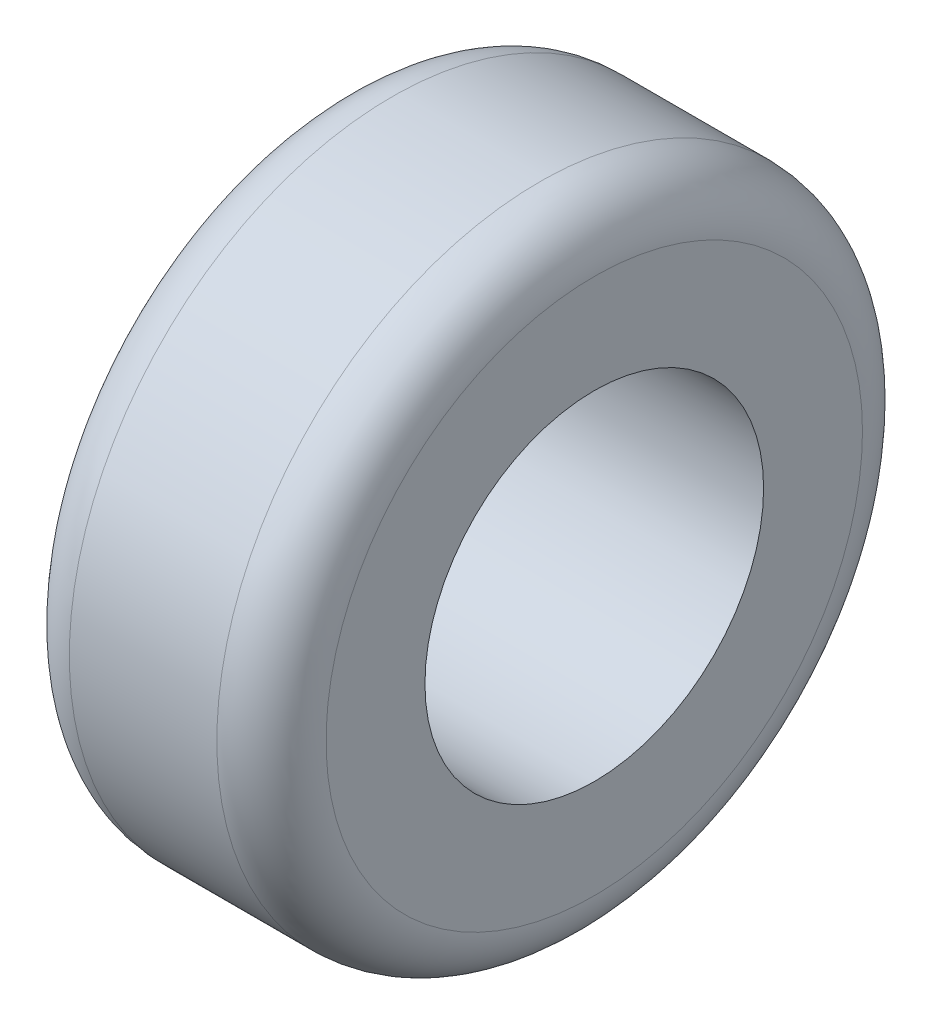
ISO-10303-21;
HEADER;
FILE_DESCRIPTION(('STEP AP214'),'2;1');
FILE_NAME('part.step','',(''),(''),'','','');
FILE_SCHEMA(('AUTOMOTIVE_DESIGN { 1 0 10303 214 1 1 1 1 }'));
ENDSEC;
DATA;
#1=APPLICATION_CONTEXT('core data for automotive mechanical design processes');
#2=APPLICATION_PROTOCOL_DEFINITION('international standard','automotive_design',2000,#1);
#3=PRODUCT_CONTEXT('',#1,'mechanical');
#4=PRODUCT('Part','Part','',(#3));
#5=PRODUCT_RELATED_PRODUCT_CATEGORY('part','',(#4));
#6=PRODUCT_DEFINITION_FORMATION('','',#4);
#7=PRODUCT_DEFINITION_CONTEXT('part definition',#1,'design');
#8=PRODUCT_DEFINITION('design','',#6,#7);
#9=PRODUCT_DEFINITION_SHAPE('','',#8);
#10=(LENGTH_UNIT() NAMED_UNIT(*) SI_UNIT(.MILLI.,.METRE.));
#11=(NAMED_UNIT(*) PLANE_ANGLE_UNIT() SI_UNIT($,.RADIAN.));
#12=(NAMED_UNIT(*) SI_UNIT($,.STERADIAN.) SOLID_ANGLE_UNIT());
#13=UNCERTAINTY_MEASURE_WITH_UNIT(LENGTH_MEASURE(1.E-05),#10,'distance_accuracy_value','');
#14=(GEOMETRIC_REPRESENTATION_CONTEXT(3) GLOBAL_UNCERTAINTY_ASSIGNED_CONTEXT((#13)) GLOBAL_UNIT_ASSIGNED_CONTEXT((#10,
#11,#12)) REPRESENTATION_CONTEXT('',''));
#15=CARTESIAN_POINT('',(0.,0.,0.));
#16=DIRECTION('',(0.,0.,1.));
#17=DIRECTION('',(1.,0.,0.));
#18=AXIS2_PLACEMENT_3D('',#15,#16,#17);
#19=CARTESIAN_POINT('',(9.4,0.,0.));
#20=DIRECTION('',(-1.,0.,0.));
#21=DIRECTION('',(0.,0.,1.));
#22=AXIS2_PLACEMENT_3D('',#19,#20,#21);
#23=CYLINDRICAL_SURFACE('',#22,11.82);
#24=CARTESIAN_POINT('',(7.4,0.,0.));
#25=DIRECTION('',(1.,0.,0.));
#26=DIRECTION('',(0.,0.,-1.));
#27=AXIS2_PLACEMENT_3D('',#24,#25,#26);
#28=CIRCLE('',#27,11.82);
#29=CARTESIAN_POINT('',(7.4,0.,-11.82));
#30=VERTEX_POINT('',#29);
#31=EDGE_CURVE('E41',#30,#30,#28,.F.);
#32=ORIENTED_EDGE('',*,*,#31,.T.);
#33=EDGE_LOOP('',(#32));
#34=FACE_BOUND('',#33,.T.);
#35=CARTESIAN_POINT('',(2.,0.,0.));
#36=DIRECTION('',(1.,0.,0.));
#37=DIRECTION('',(0.,0.,-1.));
#38=AXIS2_PLACEMENT_3D('',#35,#36,#37);
#39=CIRCLE('',#38,11.82);
#40=CARTESIAN_POINT('',(2.,0.,-11.82));
#41=VERTEX_POINT('',#40);
#42=EDGE_CURVE('E45',#41,#41,#39,.T.);
#43=ORIENTED_EDGE('',*,*,#42,.T.);
#44=EDGE_LOOP('',(#43));
#45=FACE_BOUND('',#44,.T.);
#46=ADVANCED_FACE('F34',(#34,#45),#23,.T.);
#47=CARTESIAN_POINT('',(9.4,0.,0.));
#48=DIRECTION('',(1.,0.,0.));
#49=DIRECTION('',(0.,0.,-1.));
#50=AXIS2_PLACEMENT_3D('',#47,#48,#49);
#51=PLANE('',#50);
#52=CARTESIAN_POINT('',(9.4,0.,0.));
#53=DIRECTION('',(1.,0.,0.));
#54=DIRECTION('',(0.,0.,-1.));
#55=AXIS2_PLACEMENT_3D('',#52,#53,#54);
#56=CIRCLE('',#55,9.82);
#57=CARTESIAN_POINT('',(9.4,0.,-9.82));
#58=VERTEX_POINT('',#57);
#59=EDGE_CURVE('E49',#58,#58,#56,.T.);
#60=ORIENTED_EDGE('',*,*,#59,.T.);
#61=EDGE_LOOP('',(#60));
#62=FACE_BOUND('',#61,.T.);
#63=CARTESIAN_POINT('',(9.4,0.,0.));
#64=DIRECTION('',(1.,0.,0.));
#65=DIRECTION('',(0.,0.,-1.));
#66=AXIS2_PLACEMENT_3D('',#63,#64,#65);
#67=CIRCLE('',#66,6.2);
#68=CARTESIAN_POINT('',(9.4,0.,-6.2));
#69=VERTEX_POINT('',#68);
#70=EDGE_CURVE('E55',#69,#69,#67,.T.);
#71=ORIENTED_EDGE('',*,*,#70,.F.);
#72=EDGE_LOOP('',(#71));
#73=FACE_BOUND('',#72,.T.);
#74=ADVANCED_FACE('F70',(#62,#73),#51,.T.);
#75=CARTESIAN_POINT('',(0.,0.,0.));
#76=DIRECTION('',(1.,0.,0.));
#77=DIRECTION('',(0.,0.,-1.));
#78=AXIS2_PLACEMENT_3D('',#75,#76,#77);
#79=PLANE('',#78);
#80=CARTESIAN_POINT('',(0.,0.,0.));
#81=DIRECTION('',(1.,0.,0.));
#82=DIRECTION('',(0.,0.,-1.));
#83=AXIS2_PLACEMENT_3D('',#80,#81,#82);
#84=CIRCLE('',#83,9.82);
#85=CARTESIAN_POINT('',(0.,0.,-9.82));
#86=VERTEX_POINT('',#85);
#87=EDGE_CURVE('E10',#86,#86,#84,.F.);
#88=ORIENTED_EDGE('',*,*,#87,.T.);
#89=EDGE_LOOP('',(#88));
#90=FACE_BOUND('',#89,.T.);
#91=CARTESIAN_POINT('',(0.,0.,0.));
#92=DIRECTION('',(1.,0.,0.));
#93=DIRECTION('',(0.,0.,-1.));
#94=AXIS2_PLACEMENT_3D('',#91,#92,#93);
#95=CIRCLE('',#94,6.2);
#96=CARTESIAN_POINT('',(0.,0.,-6.2));
#97=VERTEX_POINT('',#96);
#98=EDGE_CURVE('E54',#97,#97,#95,.T.);
#99=ORIENTED_EDGE('',*,*,#98,.T.);
#100=EDGE_LOOP('',(#99));
#101=FACE_BOUND('',#100,.T.);
#102=ADVANCED_FACE('F61',(#90,#101),#79,.F.);
#103=CARTESIAN_POINT('',(0.,0.,0.));
#104=DIRECTION('',(1.,0.,0.));
#105=DIRECTION('',(0.,0.,-1.));
#106=AXIS2_PLACEMENT_3D('',#103,#104,#105);
#107=CYLINDRICAL_SURFACE('',#106,6.2);
#108=ORIENTED_EDGE('',*,*,#98,.F.);
#109=EDGE_LOOP('',(#108));
#110=FACE_BOUND('',#109,.T.);
#111=ORIENTED_EDGE('',*,*,#70,.T.);
#112=EDGE_LOOP('',(#111));
#113=FACE_BOUND('',#112,.T.);
#114=ADVANCED_FACE('F63',(#110,#113),#107,.F.);
#115=CARTESIAN_POINT('',(7.4,0.,0.));
#116=DIRECTION('',(1.,0.,0.));
#117=DIRECTION('',(0.,0.,-1.));
#118=AXIS2_PLACEMENT_3D('',#115,#116,#117);
#119=TOROIDAL_SURFACE('',#118,9.82,2.);
#120=ORIENTED_EDGE('',*,*,#31,.F.);
#121=EDGE_LOOP('',(#120));
#122=FACE_BOUND('',#121,.T.);
#123=ORIENTED_EDGE('',*,*,#59,.F.);
#124=EDGE_LOOP('',(#123));
#125=FACE_BOUND('',#124,.T.);
#126=ADVANCED_FACE('F66',(#122,#125),#119,.T.);
#127=CARTESIAN_POINT('',(2.,0.,0.));
#128=DIRECTION('',(1.,0.,0.));
#129=DIRECTION('',(0.,0.,-1.));
#130=AXIS2_PLACEMENT_3D('',#127,#128,#129);
#131=TOROIDAL_SURFACE('',#130,9.82,2.);
#132=ORIENTED_EDGE('',*,*,#87,.F.);
#133=EDGE_LOOP('',(#132));
#134=FACE_BOUND('',#133,.T.);
#135=ORIENTED_EDGE('',*,*,#42,.F.);
#136=EDGE_LOOP('',(#135));
#137=FACE_BOUND('',#136,.T.);
#138=ADVANCED_FACE('F36',(#134,#137),#131,.T.);
#139=CLOSED_SHELL('',(#46,#74,#102,#114,#126,#138));
#140=MANIFOLD_SOLID_BREP('B2',#139);
#141=ADVANCED_BREP_SHAPE_REPRESENTATION('',(#18,#140),#14);
#142=SHAPE_DEFINITION_REPRESENTATION(#9,#141);
ENDSEC;
END-ISO-10303-21;
